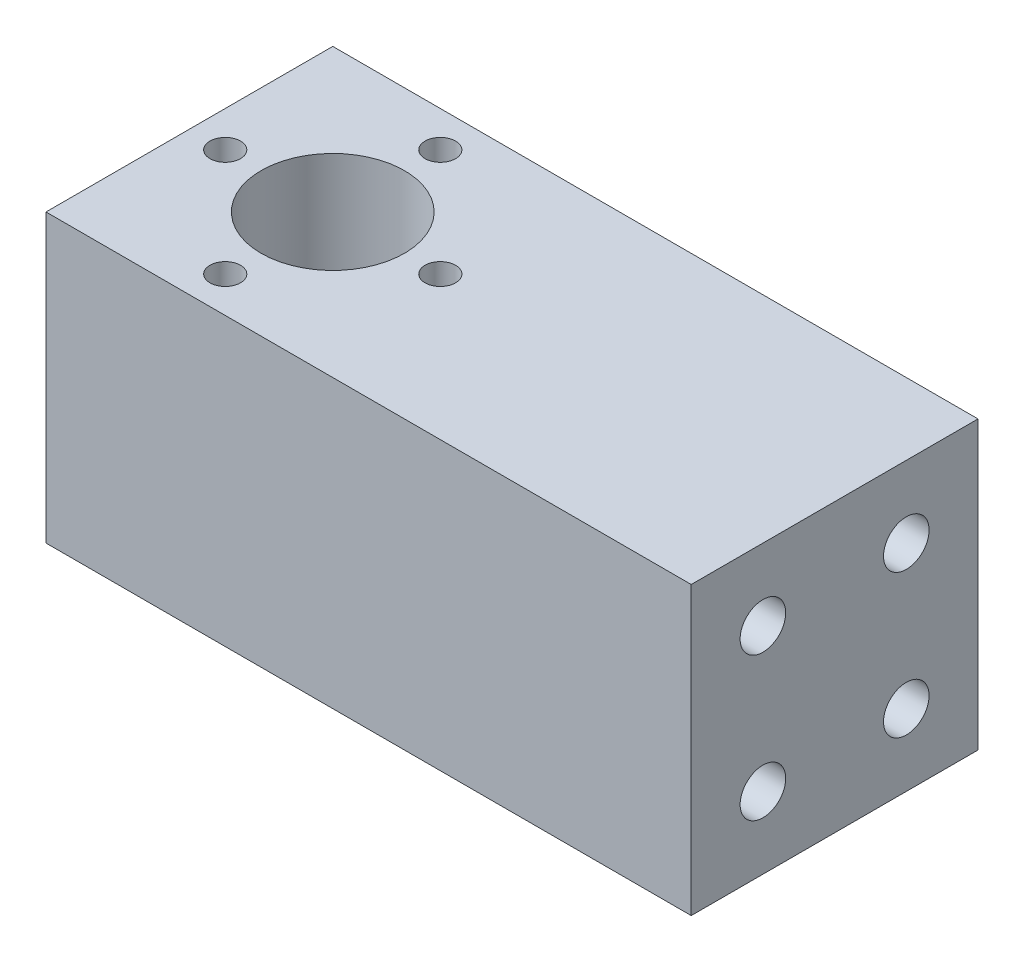
ISO-10303-21;
HEADER;
FILE_DESCRIPTION(('STEP AP214'),'2;1');
FILE_NAME('part.step','',(''),(''),'','','');
FILE_SCHEMA(('AUTOMOTIVE_DESIGN { 1 0 10303 214 1 1 1 1 }'));
ENDSEC;
DATA;
#1=APPLICATION_CONTEXT('core data for automotive mechanical design processes');
#2=APPLICATION_PROTOCOL_DEFINITION('international standard','automotive_design',2000,#1);
#3=PRODUCT_CONTEXT('',#1,'mechanical');
#4=PRODUCT('Part','Part','',(#3));
#5=PRODUCT_RELATED_PRODUCT_CATEGORY('part','',(#4));
#6=PRODUCT_DEFINITION_FORMATION('','',#4);
#7=PRODUCT_DEFINITION_CONTEXT('part definition',#1,'design');
#8=PRODUCT_DEFINITION('design','',#6,#7);
#9=PRODUCT_DEFINITION_SHAPE('','',#8);
#10=(LENGTH_UNIT() NAMED_UNIT(*) SI_UNIT(.MILLI.,.METRE.));
#11=(NAMED_UNIT(*) PLANE_ANGLE_UNIT() SI_UNIT($,.RADIAN.));
#12=(NAMED_UNIT(*) SI_UNIT($,.STERADIAN.) SOLID_ANGLE_UNIT());
#13=UNCERTAINTY_MEASURE_WITH_UNIT(LENGTH_MEASURE(1.E-05),#10,'distance_accuracy_value','');
#14=(GEOMETRIC_REPRESENTATION_CONTEXT(3) GLOBAL_UNCERTAINTY_ASSIGNED_CONTEXT((#13)) GLOBAL_UNIT_ASSIGNED_CONTEXT((#10,
#11,#12)) REPRESENTATION_CONTEXT('',''));
#15=CARTESIAN_POINT('',(0.,0.,0.));
#16=DIRECTION('',(0.,0.,1.));
#17=DIRECTION('',(1.,0.,0.));
#18=AXIS2_PLACEMENT_3D('',#15,#16,#17);
#19=CARTESIAN_POINT('',(44.45,12.7,38.1));
#20=DIRECTION('',(-1.,0.,0.));
#21=DIRECTION('',(0.,0.,1.));
#22=AXIS2_PLACEMENT_3D('',#19,#20,#21);
#23=PLANE('',#22);
#24=CARTESIAN_POINT('',(44.45,6.35,6.35));
#25=DIRECTION('',(1.,0.,0.));
#26=DIRECTION('',(0.,0.,-1.));
#27=AXIS2_PLACEMENT_3D('',#24,#25,#26);
#28=CIRCLE('',#27,2.01929999999999);
#29=CARTESIAN_POINT('',(44.45,6.35,4.33070000000001));
#30=VERTEX_POINT('',#29);
#31=EDGE_CURVE('E140',#30,#30,#28,.T.);
#32=ORIENTED_EDGE('',*,*,#31,.F.);
#33=EDGE_LOOP('',(#32));
#34=FACE_BOUND('',#33,.T.);
#35=CARTESIAN_POINT('',(44.45,6.35,-6.35));
#36=DIRECTION('',(1.,0.,0.));
#37=DIRECTION('',(0.,0.,-1.));
#38=AXIS2_PLACEMENT_3D('',#35,#36,#37);
#39=CIRCLE('',#38,2.01929999999999);
#40=CARTESIAN_POINT('',(44.45,6.35,-8.36929999999999));
#41=VERTEX_POINT('',#40);
#42=EDGE_CURVE('E149',#41,#41,#39,.T.);
#43=ORIENTED_EDGE('',*,*,#42,.F.);
#44=EDGE_LOOP('',(#43));
#45=FACE_BOUND('',#44,.T.);
#46=DIRECTION('',(0.,1.,0.));
#47=VECTOR('',#46,1.);
#48=CARTESIAN_POINT('',(44.45,0.,12.7));
#49=LINE('',#48,#47);
#50=CARTESIAN_POINT('',(44.45,-12.7,12.7));
#51=VERTEX_POINT('',#50);
#52=CARTESIAN_POINT('',(44.45,12.7,12.7));
#53=VERTEX_POINT('',#52);
#54=EDGE_CURVE('E141',#51,#53,#49,.T.);
#55=ORIENTED_EDGE('',*,*,#54,.F.);
#56=DIRECTION('',(0.,0.,-1.));
#57=VECTOR('',#56,1.);
#58=CARTESIAN_POINT('',(44.45,-12.7,38.1));
#59=LINE('',#58,#57);
#60=CARTESIAN_POINT('',(44.45,-12.7,-12.7));
#61=VERTEX_POINT('',#60);
#62=EDGE_CURVE('E131',#51,#61,#59,.T.);
#63=ORIENTED_EDGE('',*,*,#62,.T.);
#64=DIRECTION('',(0.,1.,0.));
#65=VECTOR('',#64,1.);
#66=CARTESIAN_POINT('',(44.45,0.,-12.7));
#67=LINE('',#66,#65);
#68=CARTESIAN_POINT('',(44.45,12.7,-12.7));
#69=VERTEX_POINT('',#68);
#70=EDGE_CURVE('E94',#61,#69,#67,.T.);
#71=ORIENTED_EDGE('',*,*,#70,.T.);
#72=DIRECTION('',(0.,0.,-1.));
#73=VECTOR('',#72,1.);
#74=CARTESIAN_POINT('',(44.45,12.7,38.1));
#75=LINE('',#74,#73);
#76=EDGE_CURVE('E11',#53,#69,#75,.T.);
#77=ORIENTED_EDGE('',*,*,#76,.F.);
#78=EDGE_LOOP('',(#55,#63,#71,#77));
#79=FACE_BOUND('',#78,.T.);
#80=CARTESIAN_POINT('',(44.45,-6.35,6.35));
#81=DIRECTION('',(-1.,0.,0.));
#82=DIRECTION('',(0.,0.,-1.));
#83=AXIS2_PLACEMENT_3D('',#80,#81,#82);
#84=CIRCLE('',#83,2.01929999999999);
#85=CARTESIAN_POINT('',(44.45,-6.35,4.33070000000001));
#86=VERTEX_POINT('',#85);
#87=EDGE_CURVE('E116',#86,#86,#84,.T.);
#88=ORIENTED_EDGE('',*,*,#87,.T.);
#89=EDGE_LOOP('',(#88));
#90=FACE_BOUND('',#89,.T.);
#91=CARTESIAN_POINT('',(44.45,-6.35,-6.35));
#92=DIRECTION('',(-1.,0.,0.));
#93=DIRECTION('',(0.,0.,-1.));
#94=AXIS2_PLACEMENT_3D('',#91,#92,#93);
#95=CIRCLE('',#94,2.01929999999999);
#96=CARTESIAN_POINT('',(44.45,-6.35,-8.36929999999999));
#97=VERTEX_POINT('',#96);
#98=EDGE_CURVE('E122',#97,#97,#95,.T.);
#99=ORIENTED_EDGE('',*,*,#98,.T.);
#100=EDGE_LOOP('',(#99));
#101=FACE_BOUND('',#100,.T.);
#102=ADVANCED_FACE('F37',(#34,#45,#79,#90,#101),#23,.F.);
#103=CARTESIAN_POINT('',(0.,12.7,0.));
#104=DIRECTION('',(0.,-1.,0.));
#105=DIRECTION('',(0.,0.,-1.));
#106=AXIS2_PLACEMENT_3D('',#103,#104,#105);
#107=PLANE('',#106);
#108=CARTESIAN_POINT('',(0.,12.7,-9.525));
#109=DIRECTION('',(0.,1.,0.));
#110=DIRECTION('',(0.,0.,1.));
#111=AXIS2_PLACEMENT_3D('',#108,#109,#110);
#112=CIRCLE('',#111,1.35254999999999);
#113=CARTESIAN_POINT('',(0.,12.7,-8.17245000000001));
#114=VERTEX_POINT('',#113);
#115=EDGE_CURVE('E429',#114,#114,#112,.T.);
#116=ORIENTED_EDGE('',*,*,#115,.F.);
#117=EDGE_LOOP('',(#116));
#118=FACE_BOUND('',#117,.T.);
#119=CARTESIAN_POINT('',(9.525,12.7,0.));
#120=DIRECTION('',(0.,1.,0.));
#121=DIRECTION('',(0.,0.,1.));
#122=AXIS2_PLACEMENT_3D('',#119,#120,#121);
#123=CIRCLE('',#122,1.35254999999999);
#124=CARTESIAN_POINT('',(9.525,12.7,1.35254999999999));
#125=VERTEX_POINT('',#124);
#126=EDGE_CURVE('E425',#125,#125,#123,.T.);
#127=ORIENTED_EDGE('',*,*,#126,.F.);
#128=EDGE_LOOP('',(#127));
#129=FACE_BOUND('',#128,.T.);
#130=CARTESIAN_POINT('',(0.,12.7,9.525));
#131=DIRECTION('',(0.,1.,0.));
#132=DIRECTION('',(0.,0.,1.));
#133=AXIS2_PLACEMENT_3D('',#130,#131,#132);
#134=CIRCLE('',#133,1.35254999999999);
#135=CARTESIAN_POINT('',(0.,12.7,10.87755));
#136=VERTEX_POINT('',#135);
#137=EDGE_CURVE('E419',#136,#136,#134,.T.);
#138=ORIENTED_EDGE('',*,*,#137,.F.);
#139=EDGE_LOOP('',(#138));
#140=FACE_BOUND('',#139,.T.);
#141=CARTESIAN_POINT('',(-9.525,12.7,0.));
#142=DIRECTION('',(0.,1.,0.));
#143=DIRECTION('',(0.,0.,1.));
#144=AXIS2_PLACEMENT_3D('',#141,#142,#143);
#145=CIRCLE('',#144,1.35254999999999);
#146=CARTESIAN_POINT('',(-9.525,12.7,1.35254999999999));
#147=VERTEX_POINT('',#146);
#148=EDGE_CURVE('E111',#147,#147,#145,.T.);
#149=ORIENTED_EDGE('',*,*,#148,.F.);
#150=EDGE_LOOP('',(#149));
#151=FACE_BOUND('',#150,.T.);
#152=CARTESIAN_POINT('',(0.,12.7,0.));
#153=DIRECTION('',(0.,1.,0.));
#154=DIRECTION('',(0.,0.,1.));
#155=AXIS2_PLACEMENT_3D('',#152,#153,#154);
#156=CIRCLE('',#155,6.35);
#157=CARTESIAN_POINT('',(0.,12.7,6.35));
#158=VERTEX_POINT('',#157);
#159=EDGE_CURVE('E44',#158,#158,#156,.T.);
#160=ORIENTED_EDGE('',*,*,#159,.F.);
#161=EDGE_LOOP('',(#160));
#162=FACE_BOUND('',#161,.T.);
#163=DIRECTION('',(1.,0.,0.));
#164=VECTOR('',#163,1.);
#165=CARTESIAN_POINT('',(0.,12.7,12.7));
#166=LINE('',#165,#164);
#167=CARTESIAN_POINT('',(-12.7,12.7,12.7));
#168=VERTEX_POINT('',#167);
#169=EDGE_CURVE('E95',#168,#53,#166,.T.);
#170=ORIENTED_EDGE('',*,*,#169,.T.);
#171=ORIENTED_EDGE('',*,*,#76,.T.);
#172=DIRECTION('',(-1.,0.,0.));
#173=VECTOR('',#172,1.);
#174=CARTESIAN_POINT('',(0.,12.7,-12.7));
#175=LINE('',#174,#173);
#176=CARTESIAN_POINT('',(-12.7,12.7,-12.7));
#177=VERTEX_POINT('',#176);
#178=EDGE_CURVE('E134',#69,#177,#175,.T.);
#179=ORIENTED_EDGE('',*,*,#178,.T.);
#180=DIRECTION('',(0.,0.,1.));
#181=VECTOR('',#180,1.);
#182=CARTESIAN_POINT('',(-12.7,12.7,0.));
#183=LINE('',#182,#181);
#184=EDGE_CURVE('E91',#177,#168,#183,.T.);
#185=ORIENTED_EDGE('',*,*,#184,.T.);
#186=EDGE_LOOP('',(#170,#171,#179,#185));
#187=FACE_BOUND('',#186,.T.);
#188=ADVANCED_FACE('F160',(#118,#129,#140,#151,#162,#187),#107,.F.);
#189=CARTESIAN_POINT('',(0.,0.,0.));
#190=DIRECTION('',(0.,1.,0.));
#191=DIRECTION('',(0.,0.,1.));
#192=AXIS2_PLACEMENT_3D('',#189,#190,#191);
#193=CYLINDRICAL_SURFACE('',#192,6.35);
#194=ORIENTED_EDGE('',*,*,#159,.T.);
#195=EDGE_LOOP('',(#194));
#196=FACE_BOUND('',#195,.T.);
#197=CARTESIAN_POINT('',(0.,-12.7,0.));
#198=DIRECTION('',(0.,1.,0.));
#199=DIRECTION('',(0.,0.,1.));
#200=AXIS2_PLACEMENT_3D('',#197,#198,#199);
#201=CIRCLE('',#200,6.35);
#202=CARTESIAN_POINT('',(0.,-12.7,6.35));
#203=VERTEX_POINT('',#202);
#204=EDGE_CURVE('E128',#203,#203,#201,.T.);
#205=ORIENTED_EDGE('',*,*,#204,.F.);
#206=EDGE_LOOP('',(#205));
#207=FACE_BOUND('',#206,.T.);
#208=ADVANCED_FACE('F157',(#196,#207),#193,.F.);
#209=CARTESIAN_POINT('',(34.798,6.35,-6.35));
#210=DIRECTION('',(1.,0.,0.));
#211=DIRECTION('',(0.,0.,-1.));
#212=AXIS2_PLACEMENT_3D('',#209,#210,#211);
#213=CONICAL_SURFACE('',#212,2.0193,1.02974425867666);
#214=CARTESIAN_POINT('',(33.5846821519977,6.35,-6.35));
#215=VERTEX_POINT('',#214);
#216=VERTEX_LOOP('',#215);
#217=FACE_BOUND('',#216,.T.);
#218=CARTESIAN_POINT('',(34.798,6.35,-6.35));
#219=DIRECTION('',(1.,0.,0.));
#220=DIRECTION('',(0.,0.,-1.));
#221=AXIS2_PLACEMENT_3D('',#218,#219,#220);
#222=CIRCLE('',#221,2.0193);
#223=CARTESIAN_POINT('',(34.798,6.35,-8.3693));
#224=VERTEX_POINT('',#223);
#225=EDGE_CURVE('E152',#224,#224,#222,.T.);
#226=ORIENTED_EDGE('',*,*,#225,.T.);
#227=EDGE_LOOP('',(#226));
#228=FACE_BOUND('',#227,.T.);
#229=ADVANCED_FACE('F190',(#217,#228),#213,.F.);
#230=CARTESIAN_POINT('',(44.45,6.35,-6.35));
#231=DIRECTION('',(1.,0.,0.));
#232=DIRECTION('',(0.,0.,-1.));
#233=AXIS2_PLACEMENT_3D('',#230,#231,#232);
#234=CYLINDRICAL_SURFACE('',#233,2.01929999999999);
#235=ORIENTED_EDGE('',*,*,#225,.F.);
#236=EDGE_LOOP('',(#235));
#237=FACE_BOUND('',#236,.T.);
#238=ORIENTED_EDGE('',*,*,#42,.T.);
#239=EDGE_LOOP('',(#238));
#240=FACE_BOUND('',#239,.T.);
#241=ADVANCED_FACE('F187',(#237,#240),#234,.F.);
#242=CARTESIAN_POINT('',(34.798,6.35,6.35));
#243=DIRECTION('',(1.,0.,0.));
#244=DIRECTION('',(0.,0.,-1.));
#245=AXIS2_PLACEMENT_3D('',#242,#243,#244);
#246=CONICAL_SURFACE('',#245,2.0193,1.02974425867666);
#247=CARTESIAN_POINT('',(33.5846821519977,6.35,6.35));
#248=VERTEX_POINT('',#247);
#249=VERTEX_LOOP('',#248);
#250=FACE_BOUND('',#249,.T.);
#251=CARTESIAN_POINT('',(34.798,6.35,6.35));
#252=DIRECTION('',(1.,0.,0.));
#253=DIRECTION('',(0.,0.,-1.));
#254=AXIS2_PLACEMENT_3D('',#251,#252,#253);
#255=CIRCLE('',#254,2.0193);
#256=CARTESIAN_POINT('',(34.798,6.35,4.3307));
#257=VERTEX_POINT('',#256);
#258=EDGE_CURVE('E146',#257,#257,#255,.T.);
#259=ORIENTED_EDGE('',*,*,#258,.T.);
#260=EDGE_LOOP('',(#259));
#261=FACE_BOUND('',#260,.T.);
#262=ADVANCED_FACE('F189',(#250,#261),#246,.F.);
#263=CARTESIAN_POINT('',(44.45,6.35,6.35));
#264=DIRECTION('',(1.,0.,0.));
#265=DIRECTION('',(0.,0.,-1.));
#266=AXIS2_PLACEMENT_3D('',#263,#264,#265);
#267=CYLINDRICAL_SURFACE('',#266,2.01929999999999);
#268=ORIENTED_EDGE('',*,*,#258,.F.);
#269=EDGE_LOOP('',(#268));
#270=FACE_BOUND('',#269,.T.);
#271=ORIENTED_EDGE('',*,*,#31,.T.);
#272=EDGE_LOOP('',(#271));
#273=FACE_BOUND('',#272,.T.);
#274=ADVANCED_FACE('F176',(#270,#273),#267,.F.);
#275=CARTESIAN_POINT('',(-12.7,0.,0.));
#276=DIRECTION('',(-1.,0.,0.));
#277=DIRECTION('',(0.,0.,1.));
#278=AXIS2_PLACEMENT_3D('',#275,#276,#277);
#279=PLANE('',#278);
#280=ORIENTED_EDGE('',*,*,#184,.F.);
#281=DIRECTION('',(0.,1.,0.));
#282=VECTOR('',#281,1.);
#283=CARTESIAN_POINT('',(-12.7,0.,-12.7));
#284=LINE('',#283,#282);
#285=CARTESIAN_POINT('',(-12.7,-12.7,-12.7));
#286=VERTEX_POINT('',#285);
#287=EDGE_CURVE('E83',#286,#177,#284,.T.);
#288=ORIENTED_EDGE('',*,*,#287,.F.);
#289=DIRECTION('',(0.,0.,1.));
#290=VECTOR('',#289,1.);
#291=CARTESIAN_POINT('',(-12.7,-12.7,0.));
#292=LINE('',#291,#290);
#293=CARTESIAN_POINT('',(-12.7,-12.7,12.7));
#294=VERTEX_POINT('',#293);
#295=EDGE_CURVE('E88',#286,#294,#292,.T.);
#296=ORIENTED_EDGE('',*,*,#295,.T.);
#297=DIRECTION('',(0.,1.,0.));
#298=VECTOR('',#297,1.);
#299=CARTESIAN_POINT('',(-12.7,0.,12.7));
#300=LINE('',#299,#298);
#301=EDGE_CURVE('E138',#294,#168,#300,.T.);
#302=ORIENTED_EDGE('',*,*,#301,.T.);
#303=EDGE_LOOP('',(#280,#288,#296,#302));
#304=FACE_BOUND('',#303,.T.);
#305=ADVANCED_FACE('F85',(#304),#279,.T.);
#306=CARTESIAN_POINT('',(0.,0.,12.7));
#307=DIRECTION('',(0.,0.,1.));
#308=DIRECTION('',(1.,0.,0.));
#309=AXIS2_PLACEMENT_3D('',#306,#307,#308);
#310=PLANE('',#309);
#311=ORIENTED_EDGE('',*,*,#169,.F.);
#312=ORIENTED_EDGE('',*,*,#301,.F.);
#313=DIRECTION('',(1.,0.,0.));
#314=VECTOR('',#313,1.);
#315=CARTESIAN_POINT('',(0.,-12.7,12.7));
#316=LINE('',#315,#314);
#317=EDGE_CURVE('E104',#294,#51,#316,.T.);
#318=ORIENTED_EDGE('',*,*,#317,.T.);
#319=ORIENTED_EDGE('',*,*,#54,.T.);
#320=EDGE_LOOP('',(#311,#312,#318,#319));
#321=FACE_BOUND('',#320,.T.);
#322=ADVANCED_FACE('F168',(#321),#310,.T.);
#323=CARTESIAN_POINT('',(0.,0.,-12.7));
#324=DIRECTION('',(0.,0.,-1.));
#325=DIRECTION('',(-1.,0.,0.));
#326=AXIS2_PLACEMENT_3D('',#323,#324,#325);
#327=PLANE('',#326);
#328=ORIENTED_EDGE('',*,*,#178,.F.);
#329=ORIENTED_EDGE('',*,*,#70,.F.);
#330=DIRECTION('',(-1.,0.,0.));
#331=VECTOR('',#330,1.);
#332=CARTESIAN_POINT('',(0.,-12.7,-12.7));
#333=LINE('',#332,#331);
#334=EDGE_CURVE('E98',#61,#286,#333,.T.);
#335=ORIENTED_EDGE('',*,*,#334,.T.);
#336=ORIENTED_EDGE('',*,*,#287,.T.);
#337=EDGE_LOOP('',(#328,#329,#335,#336));
#338=FACE_BOUND('',#337,.T.);
#339=ADVANCED_FACE('F99',(#338),#327,.T.);
#340=CARTESIAN_POINT('',(0.,-12.7,0.));
#341=DIRECTION('',(0.,1.,0.));
#342=DIRECTION('',(0.,0.,-1.));
#343=AXIS2_PLACEMENT_3D('',#340,#341,#342);
#344=PLANE('',#343);
#345=CARTESIAN_POINT('',(0.,-12.7,-9.525));
#346=DIRECTION('',(0.,1.,0.));
#347=DIRECTION('',(0.,0.,1.));
#348=AXIS2_PLACEMENT_3D('',#345,#346,#347);
#349=CIRCLE('',#348,1.35255);
#350=CARTESIAN_POINT('',(0.,-12.7,-8.17245));
#351=VERTEX_POINT('',#350);
#352=EDGE_CURVE('E403',#351,#351,#349,.T.);
#353=ORIENTED_EDGE('',*,*,#352,.T.);
#354=EDGE_LOOP('',(#353));
#355=FACE_BOUND('',#354,.T.);
#356=CARTESIAN_POINT('',(9.525,-12.7,0.));
#357=DIRECTION('',(0.,1.,0.));
#358=DIRECTION('',(0.,0.,1.));
#359=AXIS2_PLACEMENT_3D('',#356,#357,#358);
#360=CIRCLE('',#359,1.35255);
#361=CARTESIAN_POINT('',(9.525,-12.7,1.35255));
#362=VERTEX_POINT('',#361);
#363=EDGE_CURVE('E407',#362,#362,#360,.T.);
#364=ORIENTED_EDGE('',*,*,#363,.T.);
#365=EDGE_LOOP('',(#364));
#366=FACE_BOUND('',#365,.T.);
#367=CARTESIAN_POINT('',(0.,-12.7,9.525));
#368=DIRECTION('',(0.,1.,0.));
#369=DIRECTION('',(0.,0.,1.));
#370=AXIS2_PLACEMENT_3D('',#367,#368,#369);
#371=CIRCLE('',#370,1.35255);
#372=CARTESIAN_POINT('',(0.,-12.7,10.87755));
#373=VERTEX_POINT('',#372);
#374=EDGE_CURVE('E411',#373,#373,#371,.T.);
#375=ORIENTED_EDGE('',*,*,#374,.T.);
#376=EDGE_LOOP('',(#375));
#377=FACE_BOUND('',#376,.T.);
#378=CARTESIAN_POINT('',(-9.525,-12.7,0.));
#379=DIRECTION('',(0.,1.,0.));
#380=DIRECTION('',(0.,0.,1.));
#381=AXIS2_PLACEMENT_3D('',#378,#379,#380);
#382=CIRCLE('',#381,1.35255);
#383=CARTESIAN_POINT('',(-9.525,-12.7,1.35255));
#384=VERTEX_POINT('',#383);
#385=EDGE_CURVE('E108',#384,#384,#382,.T.);
#386=ORIENTED_EDGE('',*,*,#385,.T.);
#387=EDGE_LOOP('',(#386));
#388=FACE_BOUND('',#387,.T.);
#389=ORIENTED_EDGE('',*,*,#204,.T.);
#390=EDGE_LOOP('',(#389));
#391=FACE_BOUND('',#390,.T.);
#392=ORIENTED_EDGE('',*,*,#317,.F.);
#393=ORIENTED_EDGE('',*,*,#295,.F.);
#394=ORIENTED_EDGE('',*,*,#334,.F.);
#395=ORIENTED_EDGE('',*,*,#62,.F.);
#396=EDGE_LOOP('',(#392,#393,#394,#395));
#397=FACE_BOUND('',#396,.T.);
#398=ADVANCED_FACE('F106',(#355,#366,#377,#388,#391,#397),#344,.F.);
#399=CARTESIAN_POINT('',(34.798,-6.35,-6.35));
#400=DIRECTION('',(1.,0.,0.));
#401=DIRECTION('',(0.,0.,-1.));
#402=AXIS2_PLACEMENT_3D('',#399,#400,#401);
#403=CONICAL_SURFACE('',#402,2.0193,1.02974425867666);
#404=CARTESIAN_POINT('',(33.5846821519977,-6.35,-6.35));
#405=VERTEX_POINT('',#404);
#406=VERTEX_LOOP('',#405);
#407=FACE_BOUND('',#406,.T.);
#408=CARTESIAN_POINT('',(34.798,-6.35,-6.35));
#409=DIRECTION('',(-1.,0.,0.));
#410=DIRECTION('',(0.,0.,-1.));
#411=AXIS2_PLACEMENT_3D('',#408,#409,#410);
#412=CIRCLE('',#411,2.0193);
#413=CARTESIAN_POINT('',(34.798,-6.35,-8.3693));
#414=VERTEX_POINT('',#413);
#415=EDGE_CURVE('E125',#414,#414,#412,.T.);
#416=ORIENTED_EDGE('',*,*,#415,.F.);
#417=EDGE_LOOP('',(#416));
#418=FACE_BOUND('',#417,.T.);
#419=ADVANCED_FACE('F314',(#407,#418),#403,.F.);
#420=CARTESIAN_POINT('',(44.45,-6.35,-6.35));
#421=DIRECTION('',(1.,0.,0.));
#422=DIRECTION('',(0.,0.,-1.));
#423=AXIS2_PLACEMENT_3D('',#420,#421,#422);
#424=CYLINDRICAL_SURFACE('',#423,2.01929999999999);
#425=ORIENTED_EDGE('',*,*,#415,.T.);
#426=EDGE_LOOP('',(#425));
#427=FACE_BOUND('',#426,.T.);
#428=ORIENTED_EDGE('',*,*,#98,.F.);
#429=EDGE_LOOP('',(#428));
#430=FACE_BOUND('',#429,.T.);
#431=ADVANCED_FACE('F343',(#427,#430),#424,.F.);
#432=CARTESIAN_POINT('',(34.798,-6.35,6.35));
#433=DIRECTION('',(1.,0.,0.));
#434=DIRECTION('',(0.,0.,-1.));
#435=AXIS2_PLACEMENT_3D('',#432,#433,#434);
#436=CONICAL_SURFACE('',#435,2.0193,1.02974425867666);
#437=CARTESIAN_POINT('',(33.5846821519977,-6.35,6.35));
#438=VERTEX_POINT('',#437);
#439=VERTEX_LOOP('',#438);
#440=FACE_BOUND('',#439,.T.);
#441=CARTESIAN_POINT('',(34.798,-6.35,6.35));
#442=DIRECTION('',(-1.,0.,0.));
#443=DIRECTION('',(0.,0.,-1.));
#444=AXIS2_PLACEMENT_3D('',#441,#442,#443);
#445=CIRCLE('',#444,2.0193);
#446=CARTESIAN_POINT('',(34.798,-6.35,4.3307));
#447=VERTEX_POINT('',#446);
#448=EDGE_CURVE('E119',#447,#447,#445,.T.);
#449=ORIENTED_EDGE('',*,*,#448,.F.);
#450=EDGE_LOOP('',(#449));
#451=FACE_BOUND('',#450,.T.);
#452=ADVANCED_FACE('F353',(#440,#451),#436,.F.);
#453=CARTESIAN_POINT('',(44.45,-6.35,6.35));
#454=DIRECTION('',(1.,0.,0.));
#455=DIRECTION('',(0.,0.,-1.));
#456=AXIS2_PLACEMENT_3D('',#453,#454,#455);
#457=CYLINDRICAL_SURFACE('',#456,2.01929999999999);
#458=ORIENTED_EDGE('',*,*,#448,.T.);
#459=EDGE_LOOP('',(#458));
#460=FACE_BOUND('',#459,.T.);
#461=ORIENTED_EDGE('',*,*,#87,.F.);
#462=EDGE_LOOP('',(#461));
#463=FACE_BOUND('',#462,.T.);
#464=ADVANCED_FACE('F262',(#460,#463),#457,.F.);
#465=CARTESIAN_POINT('',(-9.525,12.7,0.));
#466=DIRECTION('',(0.,1.,0.));
#467=DIRECTION('',(0.,0.,1.));
#468=AXIS2_PLACEMENT_3D('',#465,#466,#467);
#469=CYLINDRICAL_SURFACE('',#468,1.35254999999999);
#470=ORIENTED_EDGE('',*,*,#385,.F.);
#471=EDGE_LOOP('',(#470));
#472=FACE_BOUND('',#471,.T.);
#473=ORIENTED_EDGE('',*,*,#148,.T.);
#474=EDGE_LOOP('',(#473));
#475=FACE_BOUND('',#474,.T.);
#476=ADVANCED_FACE('F256',(#472,#475),#469,.F.);
#477=CARTESIAN_POINT('',(0.,12.7,9.525));
#478=DIRECTION('',(0.,1.,0.));
#479=DIRECTION('',(0.,0.,1.));
#480=AXIS2_PLACEMENT_3D('',#477,#478,#479);
#481=CYLINDRICAL_SURFACE('',#480,1.35254999999999);
#482=ORIENTED_EDGE('',*,*,#374,.F.);
#483=EDGE_LOOP('',(#482));
#484=FACE_BOUND('',#483,.T.);
#485=ORIENTED_EDGE('',*,*,#137,.T.);
#486=EDGE_LOOP('',(#485));
#487=FACE_BOUND('',#486,.T.);
#488=ADVANCED_FACE('F261',(#484,#487),#481,.F.);
#489=CARTESIAN_POINT('',(9.525,12.7,0.));
#490=DIRECTION('',(0.,1.,0.));
#491=DIRECTION('',(0.,0.,1.));
#492=AXIS2_PLACEMENT_3D('',#489,#490,#491);
#493=CYLINDRICAL_SURFACE('',#492,1.35254999999999);
#494=ORIENTED_EDGE('',*,*,#363,.F.);
#495=EDGE_LOOP('',(#494));
#496=FACE_BOUND('',#495,.T.);
#497=ORIENTED_EDGE('',*,*,#126,.T.);
#498=EDGE_LOOP('',(#497));
#499=FACE_BOUND('',#498,.T.);
#500=ADVANCED_FACE('F276',(#496,#499),#493,.F.);
#501=CARTESIAN_POINT('',(0.,12.7,-9.525));
#502=DIRECTION('',(0.,1.,0.));
#503=DIRECTION('',(0.,0.,1.));
#504=AXIS2_PLACEMENT_3D('',#501,#502,#503);
#505=CYLINDRICAL_SURFACE('',#504,1.35254999999999);
#506=ORIENTED_EDGE('',*,*,#352,.F.);
#507=EDGE_LOOP('',(#506));
#508=FACE_BOUND('',#507,.T.);
#509=ORIENTED_EDGE('',*,*,#115,.T.);
#510=EDGE_LOOP('',(#509));
#511=FACE_BOUND('',#510,.T.);
#512=ADVANCED_FACE('F271',(#508,#511),#505,.F.);
#513=CLOSED_SHELL('',(#102,#188,#208,#229,#241,#262,#274,#305,#322,#339,#398,#419,#431,#452,
#464,#476,#488,#500,#512));
#514=MANIFOLD_SOLID_BREP('B2',#513);
#515=ADVANCED_BREP_SHAPE_REPRESENTATION('',(#18,#514),#14);
#516=SHAPE_DEFINITION_REPRESENTATION(#9,#515);
ENDSEC;
END-ISO-10303-21;
